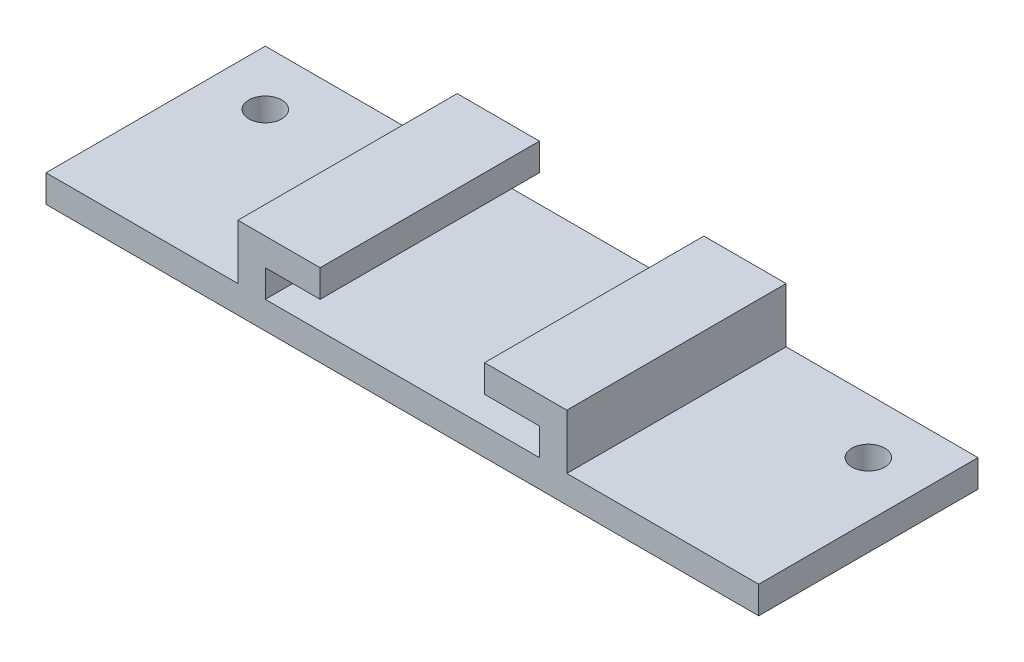
ISO-10303-21;
HEADER;
FILE_DESCRIPTION(('STEP AP214'),'2;1');
FILE_NAME('part.step','',(''),(''),'','','');
FILE_SCHEMA(('AUTOMOTIVE_DESIGN { 1 0 10303 214 1 1 1 1 }'));
ENDSEC;
DATA;
#1=APPLICATION_CONTEXT('core data for automotive mechanical design processes');
#2=APPLICATION_PROTOCOL_DEFINITION('international standard','automotive_design',2000,#1);
#3=PRODUCT_CONTEXT('',#1,'mechanical');
#4=PRODUCT('Part','Part','',(#3));
#5=PRODUCT_RELATED_PRODUCT_CATEGORY('part','',(#4));
#6=PRODUCT_DEFINITION_FORMATION('','',#4);
#7=PRODUCT_DEFINITION_CONTEXT('part definition',#1,'design');
#8=PRODUCT_DEFINITION('design','',#6,#7);
#9=PRODUCT_DEFINITION_SHAPE('','',#8);
#10=(LENGTH_UNIT() NAMED_UNIT(*) SI_UNIT(.MILLI.,.METRE.));
#11=(NAMED_UNIT(*) PLANE_ANGLE_UNIT() SI_UNIT($,.RADIAN.));
#12=(NAMED_UNIT(*) SI_UNIT($,.STERADIAN.) SOLID_ANGLE_UNIT());
#13=UNCERTAINTY_MEASURE_WITH_UNIT(LENGTH_MEASURE(1.E-05),#10,'distance_accuracy_value','');
#14=(GEOMETRIC_REPRESENTATION_CONTEXT(3) GLOBAL_UNCERTAINTY_ASSIGNED_CONTEXT((#13)) GLOBAL_UNIT_ASSIGNED_CONTEXT((#10,
#11,#12)) REPRESENTATION_CONTEXT('',''));
#15=CARTESIAN_POINT('',(0.,0.,0.));
#16=DIRECTION('',(0.,0.,1.));
#17=DIRECTION('',(1.,0.,0.));
#18=AXIS2_PLACEMENT_3D('',#15,#16,#17);
#19=CARTESIAN_POINT('',(0.,10.,0.));
#20=DIRECTION('',(0.,-1.,0.));
#21=DIRECTION('',(0.,0.,-1.));
#22=AXIS2_PLACEMENT_3D('',#19,#20,#21);
#23=PLANE('',#22);
#24=DIRECTION('',(0.,0.,1.));
#25=VECTOR('',#24,1.);
#26=CARTESIAN_POINT('',(50.,10.,-163.69316876853));
#27=LINE('',#26,#25);
#28=CARTESIAN_POINT('',(50.,10.,-40.));
#29=VERTEX_POINT('',#28);
#30=CARTESIAN_POINT('',(50.,10.,40.));
#31=VERTEX_POINT('',#30);
#32=EDGE_CURVE('E215',#29,#31,#27,.T.);
#33=ORIENTED_EDGE('',*,*,#32,.F.);
#34=DIRECTION('',(-1.,0.,0.));
#35=VECTOR('',#34,1.);
#36=CARTESIAN_POINT('',(-130.,10.,-40.));
#37=LINE('',#36,#35);
#38=CARTESIAN_POINT('',(-50.,10.,-40.));
#39=VERTEX_POINT('',#38);
#40=EDGE_CURVE('E235',#29,#39,#37,.T.);
#41=ORIENTED_EDGE('',*,*,#40,.T.);
#42=DIRECTION('',(0.,0.,1.));
#43=VECTOR('',#42,1.);
#44=CARTESIAN_POINT('',(-50.,10.,-163.69316876853));
#45=LINE('',#44,#43);
#46=CARTESIAN_POINT('',(-50.,10.,40.));
#47=VERTEX_POINT('',#46);
#48=EDGE_CURVE('E213',#39,#47,#45,.T.);
#49=ORIENTED_EDGE('',*,*,#48,.T.);
#50=DIRECTION('',(1.,0.,0.));
#51=VECTOR('',#50,1.);
#52=CARTESIAN_POINT('',(-130.,10.,40.));
#53=LINE('',#52,#51);
#54=EDGE_CURVE('E58',#47,#31,#53,.T.);
#55=ORIENTED_EDGE('',*,*,#54,.T.);
#56=EDGE_LOOP('',(#33,#41,#49,#55));
#57=FACE_BOUND('',#56,.T.);
#58=ADVANCED_FACE('F35',(#57),#23,.F.);
#59=CARTESIAN_POINT('',(-110.,10.,-20.));
#60=DIRECTION('',(0.,1.,0.));
#61=DIRECTION('',(0.,0.,1.));
#62=AXIS2_PLACEMENT_3D('',#59,#60,#61);
#63=CIRCLE('',#62,6.00000000000001);
#64=CARTESIAN_POINT('',(-110.,10.,-14.));
#65=VERTEX_POINT('',#64);
#66=EDGE_CURVE('E177',#65,#65,#63,.T.);
#67=ORIENTED_EDGE('',*,*,#66,.F.);
#68=EDGE_LOOP('',(#67));
#69=FACE_BOUND('',#68,.T.);
#70=CARTESIAN_POINT('',(-130.,10.,40.));
#71=VERTEX_POINT('',#70);
#72=CARTESIAN_POINT('',(-60.,10.,40.));
#73=VERTEX_POINT('',#72);
#74=EDGE_CURVE('E238',#71,#73,#53,.T.);
#75=ORIENTED_EDGE('',*,*,#74,.T.);
#76=DIRECTION('',(0.,0.,-1.));
#77=VECTOR('',#76,1.);
#78=CARTESIAN_POINT('',(-60.,10.,0.));
#79=LINE('',#78,#77);
#80=CARTESIAN_POINT('',(-60.,10.,-40.));
#81=VERTEX_POINT('',#80);
#82=EDGE_CURVE('E223',#73,#81,#79,.T.);
#83=ORIENTED_EDGE('',*,*,#82,.T.);
#84=CARTESIAN_POINT('',(-130.,10.,-40.));
#85=VERTEX_POINT('',#84);
#86=EDGE_CURVE('E230',#81,#85,#37,.T.);
#87=ORIENTED_EDGE('',*,*,#86,.T.);
#88=DIRECTION('',(0.,0.,1.));
#89=VECTOR('',#88,1.);
#90=CARTESIAN_POINT('',(-130.,10.,40.));
#91=LINE('',#90,#89);
#92=EDGE_CURVE('E234',#85,#71,#91,.T.);
#93=ORIENTED_EDGE('',*,*,#92,.T.);
#94=EDGE_LOOP('',(#75,#83,#87,#93));
#95=FACE_BOUND('',#94,.T.);
#96=ADVANCED_FACE('F307',(#69,#95),#23,.F.);
#97=CARTESIAN_POINT('',(130.,10.,40.));
#98=DIRECTION('',(-1.,0.,0.));
#99=DIRECTION('',(0.,0.,1.));
#100=AXIS2_PLACEMENT_3D('',#97,#98,#99);
#101=PLANE('',#100);
#102=DIRECTION('',(0.,0.,-1.));
#103=VECTOR('',#102,1.);
#104=CARTESIAN_POINT('',(130.,0.,40.));
#105=LINE('',#104,#103);
#106=CARTESIAN_POINT('',(130.,0.,40.));
#107=VERTEX_POINT('',#106);
#108=CARTESIAN_POINT('',(130.,0.,-40.));
#109=VERTEX_POINT('',#108);
#110=EDGE_CURVE('E226',#107,#109,#105,.T.);
#111=ORIENTED_EDGE('',*,*,#110,.T.);
#112=DIRECTION('',(0.,-1.,0.));
#113=VECTOR('',#112,1.);
#114=CARTESIAN_POINT('',(130.,10.,-40.));
#115=LINE('',#114,#113);
#116=CARTESIAN_POINT('',(130.,10.,-40.));
#117=VERTEX_POINT('',#116);
#118=EDGE_CURVE('E11',#117,#109,#115,.T.);
#119=ORIENTED_EDGE('',*,*,#118,.F.);
#120=DIRECTION('',(0.,0.,-1.));
#121=VECTOR('',#120,1.);
#122=CARTESIAN_POINT('',(130.,10.,40.));
#123=LINE('',#122,#121);
#124=CARTESIAN_POINT('',(130.,10.,40.));
#125=VERTEX_POINT('',#124);
#126=EDGE_CURVE('E227',#125,#117,#123,.T.);
#127=ORIENTED_EDGE('',*,*,#126,.F.);
#128=DIRECTION('',(0.,-1.,0.));
#129=VECTOR('',#128,1.);
#130=CARTESIAN_POINT('',(130.,10.,40.));
#131=LINE('',#130,#129);
#132=EDGE_CURVE('E240',#125,#107,#131,.T.);
#133=ORIENTED_EDGE('',*,*,#132,.T.);
#134=EDGE_LOOP('',(#111,#119,#127,#133));
#135=FACE_BOUND('',#134,.T.);
#136=ADVANCED_FACE('F37',(#135),#101,.F.);
#137=CARTESIAN_POINT('',(-130.,10.,-40.));
#138=DIRECTION('',(0.,0.,1.));
#139=DIRECTION('',(1.,0.,0.));
#140=AXIS2_PLACEMENT_3D('',#137,#138,#139);
#141=PLANE('',#140);
#142=DIRECTION('',(-1.,0.,0.));
#143=VECTOR('',#142,1.);
#144=CARTESIAN_POINT('',(-130.,0.,-40.));
#145=LINE('',#144,#143);
#146=CARTESIAN_POINT('',(-130.,0.,-40.));
#147=VERTEX_POINT('',#146);
#148=EDGE_CURVE('E243',#109,#147,#145,.T.);
#149=ORIENTED_EDGE('',*,*,#148,.T.);
#150=DIRECTION('',(0.,-1.,0.));
#151=VECTOR('',#150,1.);
#152=CARTESIAN_POINT('',(-130.,10.,-40.));
#153=LINE('',#152,#151);
#154=EDGE_CURVE('E43',#85,#147,#153,.T.);
#155=ORIENTED_EDGE('',*,*,#154,.F.);
#156=ORIENTED_EDGE('',*,*,#86,.F.);
#157=DIRECTION('',(0.,1.,0.));
#158=VECTOR('',#157,1.);
#159=CARTESIAN_POINT('',(-60.,25.,-40.));
#160=LINE('',#159,#158);
#161=CARTESIAN_POINT('',(-60.,30.,-40.));
#162=VERTEX_POINT('',#161);
#163=EDGE_CURVE('E275',#81,#162,#160,.T.);
#164=ORIENTED_EDGE('',*,*,#163,.T.);
#165=DIRECTION('',(1.,0.,0.));
#166=VECTOR('',#165,1.);
#167=CARTESIAN_POINT('',(-30.,30.,-40.));
#168=LINE('',#167,#166);
#169=CARTESIAN_POINT('',(-30.,30.,-40.));
#170=VERTEX_POINT('',#169);
#171=EDGE_CURVE('E276',#162,#170,#168,.T.);
#172=ORIENTED_EDGE('',*,*,#171,.T.);
#173=DIRECTION('',(0.,1.,0.));
#174=VECTOR('',#173,1.);
#175=CARTESIAN_POINT('',(-30.,30.,-40.));
#176=LINE('',#175,#174);
#177=CARTESIAN_POINT('',(-30.,20.,-40.));
#178=VERTEX_POINT('',#177);
#179=EDGE_CURVE('E280',#178,#170,#176,.T.);
#180=ORIENTED_EDGE('',*,*,#179,.F.);
#181=DIRECTION('',(1.,0.,0.));
#182=VECTOR('',#181,1.);
#183=CARTESIAN_POINT('',(-30.,20.,-40.));
#184=LINE('',#183,#182);
#185=CARTESIAN_POINT('',(-50.,20.,-40.));
#186=VERTEX_POINT('',#185);
#187=EDGE_CURVE('E283',#186,#178,#184,.T.);
#188=ORIENTED_EDGE('',*,*,#187,.F.);
#189=DIRECTION('',(0.,1.,0.));
#190=VECTOR('',#189,1.);
#191=CARTESIAN_POINT('',(-50.,25.,-40.));
#192=LINE('',#191,#190);
#193=EDGE_CURVE('E286',#39,#186,#192,.T.);
#194=ORIENTED_EDGE('',*,*,#193,.F.);
#195=ORIENTED_EDGE('',*,*,#40,.F.);
#196=DIRECTION('',(0.,-1.,0.));
#197=VECTOR('',#196,1.);
#198=CARTESIAN_POINT('',(50.,5.00000000000002,-40.));
#199=LINE('',#198,#197);
#200=CARTESIAN_POINT('',(50.,20.,-40.));
#201=VERTEX_POINT('',#200);
#202=EDGE_CURVE('E289',#201,#29,#199,.T.);
#203=ORIENTED_EDGE('',*,*,#202,.F.);
#204=DIRECTION('',(1.,0.,0.));
#205=VECTOR('',#204,1.);
#206=CARTESIAN_POINT('',(55.,20.,-40.));
#207=LINE('',#206,#205);
#208=CARTESIAN_POINT('',(30.,20.,-40.));
#209=VERTEX_POINT('',#208);
#210=EDGE_CURVE('E221',#209,#201,#207,.T.);
#211=ORIENTED_EDGE('',*,*,#210,.F.);
#212=DIRECTION('',(0.,-1.,0.));
#213=VECTOR('',#212,1.);
#214=CARTESIAN_POINT('',(30.,20.,-40.));
#215=LINE('',#214,#213);
#216=CARTESIAN_POINT('',(30.,30.,-40.));
#217=VERTEX_POINT('',#216);
#218=EDGE_CURVE('E204',#217,#209,#215,.T.);
#219=ORIENTED_EDGE('',*,*,#218,.F.);
#220=DIRECTION('',(1.,0.,0.));
#221=VECTOR('',#220,1.);
#222=CARTESIAN_POINT('',(55.,30.,-40.));
#223=LINE('',#222,#221);
#224=CARTESIAN_POINT('',(60.,30.,-40.));
#225=VERTEX_POINT('',#224);
#226=EDGE_CURVE('E156',#217,#225,#223,.T.);
#227=ORIENTED_EDGE('',*,*,#226,.T.);
#228=DIRECTION('',(0.,-1.,0.));
#229=VECTOR('',#228,1.);
#230=CARTESIAN_POINT('',(60.,5.00000000000002,-40.));
#231=LINE('',#230,#229);
#232=CARTESIAN_POINT('',(60.,10.,-40.));
#233=VERTEX_POINT('',#232);
#234=EDGE_CURVE('E274',#225,#233,#231,.T.);
#235=ORIENTED_EDGE('',*,*,#234,.T.);
#236=EDGE_CURVE('E232',#117,#233,#37,.T.);
#237=ORIENTED_EDGE('',*,*,#236,.F.);
#238=ORIENTED_EDGE('',*,*,#118,.T.);
#239=EDGE_LOOP('',(#149,#155,#156,#164,#172,#180,#188,#194,#195,#203,#211,#219,#227,#235,#237,#238));
#240=FACE_BOUND('',#239,.T.);
#241=ADVANCED_FACE('F323',(#240),#141,.F.);
#242=CARTESIAN_POINT('',(-130.,10.,40.));
#243=DIRECTION('',(1.,0.,0.));
#244=DIRECTION('',(0.,0.,-1.));
#245=AXIS2_PLACEMENT_3D('',#242,#243,#244);
#246=PLANE('',#245);
#247=DIRECTION('',(0.,0.,1.));
#248=VECTOR('',#247,1.);
#249=CARTESIAN_POINT('',(-130.,0.,40.));
#250=LINE('',#249,#248);
#251=CARTESIAN_POINT('',(-130.,0.,40.));
#252=VERTEX_POINT('',#251);
#253=EDGE_CURVE('E245',#147,#252,#250,.T.);
#254=ORIENTED_EDGE('',*,*,#253,.T.);
#255=DIRECTION('',(0.,-1.,0.));
#256=VECTOR('',#255,1.);
#257=CARTESIAN_POINT('',(-130.,10.,40.));
#258=LINE('',#257,#256);
#259=EDGE_CURVE('E250',#71,#252,#258,.T.);
#260=ORIENTED_EDGE('',*,*,#259,.F.);
#261=ORIENTED_EDGE('',*,*,#92,.F.);
#262=ORIENTED_EDGE('',*,*,#154,.T.);
#263=EDGE_LOOP('',(#254,#260,#261,#262));
#264=FACE_BOUND('',#263,.T.);
#265=ADVANCED_FACE('F257',(#264),#246,.F.);
#266=CARTESIAN_POINT('',(-130.,10.,40.));
#267=DIRECTION('',(0.,0.,-1.));
#268=DIRECTION('',(-1.,0.,0.));
#269=AXIS2_PLACEMENT_3D('',#266,#267,#268);
#270=PLANE('',#269);
#271=CARTESIAN_POINT('',(60.,10.,40.));
#272=VERTEX_POINT('',#271);
#273=EDGE_CURVE('E237',#272,#125,#53,.T.);
#274=ORIENTED_EDGE('',*,*,#273,.F.);
#275=DIRECTION('',(0.,1.,0.));
#276=VECTOR('',#275,1.);
#277=CARTESIAN_POINT('',(60.,5.00000000000002,40.));
#278=LINE('',#277,#276);
#279=CARTESIAN_POINT('',(60.,30.,40.));
#280=VERTEX_POINT('',#279);
#281=EDGE_CURVE('E160',#272,#280,#278,.T.);
#282=ORIENTED_EDGE('',*,*,#281,.T.);
#283=DIRECTION('',(-1.,0.,0.));
#284=VECTOR('',#283,1.);
#285=CARTESIAN_POINT('',(55.,30.,40.));
#286=LINE('',#285,#284);
#287=CARTESIAN_POINT('',(30.,30.,40.));
#288=VERTEX_POINT('',#287);
#289=EDGE_CURVE('E155',#280,#288,#286,.T.);
#290=ORIENTED_EDGE('',*,*,#289,.T.);
#291=DIRECTION('',(0.,1.,0.));
#292=VECTOR('',#291,1.);
#293=CARTESIAN_POINT('',(30.,20.,40.));
#294=LINE('',#293,#292);
#295=CARTESIAN_POINT('',(30.,20.,40.));
#296=VERTEX_POINT('',#295);
#297=EDGE_CURVE('E163',#296,#288,#294,.T.);
#298=ORIENTED_EDGE('',*,*,#297,.F.);
#299=DIRECTION('',(-1.,0.,0.));
#300=VECTOR('',#299,1.);
#301=CARTESIAN_POINT('',(55.,20.,40.));
#302=LINE('',#301,#300);
#303=CARTESIAN_POINT('',(50.,20.,40.));
#304=VERTEX_POINT('',#303);
#305=EDGE_CURVE('E169',#304,#296,#302,.T.);
#306=ORIENTED_EDGE('',*,*,#305,.F.);
#307=DIRECTION('',(0.,1.,0.));
#308=VECTOR('',#307,1.);
#309=CARTESIAN_POINT('',(50.,5.00000000000002,40.));
#310=LINE('',#309,#308);
#311=EDGE_CURVE('E183',#31,#304,#310,.T.);
#312=ORIENTED_EDGE('',*,*,#311,.F.);
#313=ORIENTED_EDGE('',*,*,#54,.F.);
#314=DIRECTION('',(0.,-1.,0.));
#315=VECTOR('',#314,1.);
#316=CARTESIAN_POINT('',(-50.,25.,40.));
#317=LINE('',#316,#315);
#318=CARTESIAN_POINT('',(-50.,20.,40.));
#319=VERTEX_POINT('',#318);
#320=EDGE_CURVE('E186',#319,#47,#317,.T.);
#321=ORIENTED_EDGE('',*,*,#320,.F.);
#322=DIRECTION('',(-1.,0.,0.));
#323=VECTOR('',#322,1.);
#324=CARTESIAN_POINT('',(-30.,20.,40.));
#325=LINE('',#324,#323);
#326=CARTESIAN_POINT('',(-30.,20.,40.));
#327=VERTEX_POINT('',#326);
#328=EDGE_CURVE('E189',#327,#319,#325,.T.);
#329=ORIENTED_EDGE('',*,*,#328,.F.);
#330=DIRECTION('',(0.,-1.,0.));
#331=VECTOR('',#330,1.);
#332=CARTESIAN_POINT('',(-30.,30.,40.));
#333=LINE('',#332,#331);
#334=CARTESIAN_POINT('',(-30.,30.,40.));
#335=VERTEX_POINT('',#334);
#336=EDGE_CURVE('E192',#335,#327,#333,.T.);
#337=ORIENTED_EDGE('',*,*,#336,.F.);
#338=DIRECTION('',(-1.,0.,0.));
#339=VECTOR('',#338,1.);
#340=CARTESIAN_POINT('',(-30.,30.,40.));
#341=LINE('',#340,#339);
#342=CARTESIAN_POINT('',(-60.,30.,40.));
#343=VERTEX_POINT('',#342);
#344=EDGE_CURVE('E195',#335,#343,#341,.T.);
#345=ORIENTED_EDGE('',*,*,#344,.T.);
#346=DIRECTION('',(0.,-1.,0.));
#347=VECTOR('',#346,1.);
#348=CARTESIAN_POINT('',(-60.,25.,40.));
#349=LINE('',#348,#347);
#350=EDGE_CURVE('E198',#343,#73,#349,.T.);
#351=ORIENTED_EDGE('',*,*,#350,.T.);
#352=ORIENTED_EDGE('',*,*,#74,.F.);
#353=ORIENTED_EDGE('',*,*,#259,.T.);
#354=DIRECTION('',(1.,0.,0.));
#355=VECTOR('',#354,1.);
#356=CARTESIAN_POINT('',(-130.,0.,40.));
#357=LINE('',#356,#355);
#358=EDGE_CURVE('E231',#252,#107,#357,.T.);
#359=ORIENTED_EDGE('',*,*,#358,.T.);
#360=ORIENTED_EDGE('',*,*,#132,.F.);
#361=EDGE_LOOP('',(#274,#282,#290,#298,#306,#312,#313,#321,#329,#337,#345,#351,#352,#353,#359,#360));
#362=FACE_BOUND('',#361,.T.);
#363=ADVANCED_FACE('F171',(#362),#270,.F.);
#364=CARTESIAN_POINT('',(110.,10.,-20.));
#365=DIRECTION('',(0.,1.,0.));
#366=DIRECTION('',(0.,0.,1.));
#367=AXIS2_PLACEMENT_3D('',#364,#365,#366);
#368=CIRCLE('',#367,6.00000000000001);
#369=CARTESIAN_POINT('',(110.,10.,-14.));
#370=VERTEX_POINT('',#369);
#371=EDGE_CURVE('E299',#370,#370,#368,.T.);
#372=ORIENTED_EDGE('',*,*,#371,.F.);
#373=EDGE_LOOP('',(#372));
#374=FACE_BOUND('',#373,.T.);
#375=ORIENTED_EDGE('',*,*,#236,.T.);
#376=DIRECTION('',(0.,0.,1.));
#377=VECTOR('',#376,1.);
#378=CARTESIAN_POINT('',(60.,10.,0.));
#379=LINE('',#378,#377);
#380=EDGE_CURVE('E50',#233,#272,#379,.T.);
#381=ORIENTED_EDGE('',*,*,#380,.T.);
#382=ORIENTED_EDGE('',*,*,#273,.T.);
#383=ORIENTED_EDGE('',*,*,#126,.T.);
#384=EDGE_LOOP('',(#375,#381,#382,#383));
#385=FACE_BOUND('',#384,.T.);
#386=ADVANCED_FACE('F269',(#374,#385),#23,.F.);
#387=CARTESIAN_POINT('',(0.,0.,0.));
#388=DIRECTION('',(0.,-1.,0.));
#389=DIRECTION('',(0.,0.,-1.));
#390=AXIS2_PLACEMENT_3D('',#387,#388,#389);
#391=PLANE('',#390);
#392=CARTESIAN_POINT('',(110.,0.,-20.));
#393=DIRECTION('',(0.,1.,0.));
#394=DIRECTION('',(0.,0.,1.));
#395=AXIS2_PLACEMENT_3D('',#392,#393,#394);
#396=CIRCLE('',#395,5.99999999999999);
#397=CARTESIAN_POINT('',(110.,0.,-14.));
#398=VERTEX_POINT('',#397);
#399=EDGE_CURVE('E296',#398,#398,#396,.T.);
#400=ORIENTED_EDGE('',*,*,#399,.T.);
#401=EDGE_LOOP('',(#400));
#402=FACE_BOUND('',#401,.T.);
#403=CARTESIAN_POINT('',(-110.,0.,-20.));
#404=DIRECTION('',(0.,1.,0.));
#405=DIRECTION('',(0.,0.,1.));
#406=AXIS2_PLACEMENT_3D('',#403,#404,#405);
#407=CIRCLE('',#406,5.99999999999999);
#408=CARTESIAN_POINT('',(-110.,0.,-14.));
#409=VERTEX_POINT('',#408);
#410=EDGE_CURVE('E174',#409,#409,#407,.T.);
#411=ORIENTED_EDGE('',*,*,#410,.T.);
#412=EDGE_LOOP('',(#411));
#413=FACE_BOUND('',#412,.T.);
#414=ORIENTED_EDGE('',*,*,#110,.F.);
#415=ORIENTED_EDGE('',*,*,#358,.F.);
#416=ORIENTED_EDGE('',*,*,#253,.F.);
#417=ORIENTED_EDGE('',*,*,#148,.F.);
#418=EDGE_LOOP('',(#414,#415,#416,#417));
#419=FACE_BOUND('',#418,.T.);
#420=ADVANCED_FACE('F263',(#402,#413,#419),#391,.T.);
#421=CARTESIAN_POINT('',(-30.,20.,-163.69316876853));
#422=DIRECTION('',(0.,1.,0.));
#423=DIRECTION('',(-1.,0.,0.));
#424=AXIS2_PLACEMENT_3D('',#421,#422,#423);
#425=PLANE('',#424);
#426=DIRECTION('',(0.,0.,1.));
#427=VECTOR('',#426,1.);
#428=CARTESIAN_POINT('',(-50.,20.,-163.69316876853));
#429=LINE('',#428,#427);
#430=EDGE_CURVE('E211',#186,#319,#429,.T.);
#431=ORIENTED_EDGE('',*,*,#430,.F.);
#432=ORIENTED_EDGE('',*,*,#187,.T.);
#433=DIRECTION('',(0.,0.,1.));
#434=VECTOR('',#433,1.);
#435=CARTESIAN_POINT('',(-30.,20.,-163.69316876853));
#436=LINE('',#435,#434);
#437=EDGE_CURVE('E209',#178,#327,#436,.T.);
#438=ORIENTED_EDGE('',*,*,#437,.T.);
#439=ORIENTED_EDGE('',*,*,#328,.T.);
#440=EDGE_LOOP('',(#431,#432,#438,#439));
#441=FACE_BOUND('',#440,.T.);
#442=ADVANCED_FACE('F312',(#441),#425,.F.);
#443=CARTESIAN_POINT('',(-30.,30.,-163.69316876853));
#444=DIRECTION('',(-1.,0.,0.));
#445=DIRECTION('',(0.,0.,1.));
#446=AXIS2_PLACEMENT_3D('',#443,#444,#445);
#447=PLANE('',#446);
#448=ORIENTED_EDGE('',*,*,#437,.F.);
#449=ORIENTED_EDGE('',*,*,#179,.T.);
#450=DIRECTION('',(0.,0.,1.));
#451=VECTOR('',#450,1.);
#452=CARTESIAN_POINT('',(-30.,30.,-163.69316876853));
#453=LINE('',#452,#451);
#454=EDGE_CURVE('E207',#170,#335,#453,.T.);
#455=ORIENTED_EDGE('',*,*,#454,.T.);
#456=ORIENTED_EDGE('',*,*,#336,.T.);
#457=EDGE_LOOP('',(#448,#449,#455,#456));
#458=FACE_BOUND('',#457,.T.);
#459=ADVANCED_FACE('F382',(#458),#447,.F.);
#460=CARTESIAN_POINT('',(-30.,30.,-163.69316876853));
#461=DIRECTION('',(0.,1.,0.));
#462=DIRECTION('',(-1.,0.,0.));
#463=AXIS2_PLACEMENT_3D('',#460,#461,#462);
#464=PLANE('',#463);
#465=ORIENTED_EDGE('',*,*,#171,.F.);
#466=DIRECTION('',(0.,0.,1.));
#467=VECTOR('',#466,1.);
#468=CARTESIAN_POINT('',(-60.,30.,-163.69316876853));
#469=LINE('',#468,#467);
#470=EDGE_CURVE('E205',#162,#343,#469,.T.);
#471=ORIENTED_EDGE('',*,*,#470,.T.);
#472=ORIENTED_EDGE('',*,*,#344,.F.);
#473=ORIENTED_EDGE('',*,*,#454,.F.);
#474=EDGE_LOOP('',(#465,#471,#472,#473));
#475=FACE_BOUND('',#474,.T.);
#476=ADVANCED_FACE('F338',(#475),#464,.T.);
#477=CARTESIAN_POINT('',(-60.,25.,-163.69316876853));
#478=DIRECTION('',(-1.,0.,0.));
#479=DIRECTION('',(0.,-1.,0.));
#480=AXIS2_PLACEMENT_3D('',#477,#478,#479);
#481=PLANE('',#480);
#482=ORIENTED_EDGE('',*,*,#82,.F.);
#483=ORIENTED_EDGE('',*,*,#350,.F.);
#484=ORIENTED_EDGE('',*,*,#470,.F.);
#485=ORIENTED_EDGE('',*,*,#163,.F.);
#486=EDGE_LOOP('',(#482,#483,#484,#485));
#487=FACE_BOUND('',#486,.T.);
#488=ADVANCED_FACE('F330',(#487),#481,.T.);
#489=CARTESIAN_POINT('',(-50.,25.,-163.69316876853));
#490=DIRECTION('',(-1.,0.,0.));
#491=DIRECTION('',(0.,-1.,0.));
#492=AXIS2_PLACEMENT_3D('',#489,#490,#491);
#493=PLANE('',#492);
#494=ORIENTED_EDGE('',*,*,#48,.F.);
#495=ORIENTED_EDGE('',*,*,#193,.T.);
#496=ORIENTED_EDGE('',*,*,#430,.T.);
#497=ORIENTED_EDGE('',*,*,#320,.T.);
#498=EDGE_LOOP('',(#494,#495,#496,#497));
#499=FACE_BOUND('',#498,.T.);
#500=ADVANCED_FACE('F344',(#499),#493,.F.);
#501=CARTESIAN_POINT('',(60.,5.00000000000002,-163.69316876853));
#502=DIRECTION('',(1.,0.,0.));
#503=DIRECTION('',(0.,1.,0.));
#504=AXIS2_PLACEMENT_3D('',#501,#502,#503);
#505=PLANE('',#504);
#506=ORIENTED_EDGE('',*,*,#380,.F.);
#507=ORIENTED_EDGE('',*,*,#234,.F.);
#508=DIRECTION('',(0.,0.,1.));
#509=VECTOR('',#508,1.);
#510=CARTESIAN_POINT('',(60.,30.,-163.69316876853));
#511=LINE('',#510,#509);
#512=EDGE_CURVE('E202',#225,#280,#511,.T.);
#513=ORIENTED_EDGE('',*,*,#512,.T.);
#514=ORIENTED_EDGE('',*,*,#281,.F.);
#515=EDGE_LOOP('',(#506,#507,#513,#514));
#516=FACE_BOUND('',#515,.T.);
#517=ADVANCED_FACE('F271',(#516),#505,.T.);
#518=CARTESIAN_POINT('',(30.,20.,-163.69316876853));
#519=DIRECTION('',(1.,0.,0.));
#520=DIRECTION('',(0.,0.,-1.));
#521=AXIS2_PLACEMENT_3D('',#518,#519,#520);
#522=PLANE('',#521);
#523=DIRECTION('',(0.,0.,1.));
#524=VECTOR('',#523,1.);
#525=CARTESIAN_POINT('',(30.,30.,-163.69316876853));
#526=LINE('',#525,#524);
#527=EDGE_CURVE('E150',#217,#288,#526,.T.);
#528=ORIENTED_EDGE('',*,*,#527,.F.);
#529=ORIENTED_EDGE('',*,*,#218,.T.);
#530=DIRECTION('',(0.,0.,1.));
#531=VECTOR('',#530,1.);
#532=CARTESIAN_POINT('',(30.,20.,-163.69316876853));
#533=LINE('',#532,#531);
#534=EDGE_CURVE('E159',#209,#296,#533,.T.);
#535=ORIENTED_EDGE('',*,*,#534,.T.);
#536=ORIENTED_EDGE('',*,*,#297,.T.);
#537=EDGE_LOOP('',(#528,#529,#535,#536));
#538=FACE_BOUND('',#537,.T.);
#539=ADVANCED_FACE('F164',(#538),#522,.F.);
#540=CARTESIAN_POINT('',(55.,20.,-163.69316876853));
#541=DIRECTION('',(0.,1.,0.));
#542=DIRECTION('',(-1.,0.,0.));
#543=AXIS2_PLACEMENT_3D('',#540,#541,#542);
#544=PLANE('',#543);
#545=ORIENTED_EDGE('',*,*,#534,.F.);
#546=ORIENTED_EDGE('',*,*,#210,.T.);
#547=DIRECTION('',(0.,0.,1.));
#548=VECTOR('',#547,1.);
#549=CARTESIAN_POINT('',(50.,20.,-163.69316876853));
#550=LINE('',#549,#548);
#551=EDGE_CURVE('E217',#201,#304,#550,.T.);
#552=ORIENTED_EDGE('',*,*,#551,.T.);
#553=ORIENTED_EDGE('',*,*,#305,.T.);
#554=EDGE_LOOP('',(#545,#546,#552,#553));
#555=FACE_BOUND('',#554,.T.);
#556=ADVANCED_FACE('F351',(#555),#544,.F.);
#557=CARTESIAN_POINT('',(50.,5.00000000000002,-163.69316876853));
#558=DIRECTION('',(1.,0.,0.));
#559=DIRECTION('',(0.,1.,0.));
#560=AXIS2_PLACEMENT_3D('',#557,#558,#559);
#561=PLANE('',#560);
#562=ORIENTED_EDGE('',*,*,#551,.F.);
#563=ORIENTED_EDGE('',*,*,#202,.T.);
#564=ORIENTED_EDGE('',*,*,#32,.T.);
#565=ORIENTED_EDGE('',*,*,#311,.T.);
#566=EDGE_LOOP('',(#562,#563,#564,#565));
#567=FACE_BOUND('',#566,.T.);
#568=ADVANCED_FACE('F349',(#567),#561,.F.);
#569=CARTESIAN_POINT('',(55.,30.,-163.69316876853));
#570=DIRECTION('',(0.,1.,0.));
#571=DIRECTION('',(-1.,0.,0.));
#572=AXIS2_PLACEMENT_3D('',#569,#570,#571);
#573=PLANE('',#572);
#574=ORIENTED_EDGE('',*,*,#226,.F.);
#575=ORIENTED_EDGE('',*,*,#527,.T.);
#576=ORIENTED_EDGE('',*,*,#289,.F.);
#577=ORIENTED_EDGE('',*,*,#512,.F.);
#578=EDGE_LOOP('',(#574,#575,#576,#577));
#579=FACE_BOUND('',#578,.T.);
#580=ADVANCED_FACE('F152',(#579),#573,.T.);
#581=CARTESIAN_POINT('',(-110.,10.,-20.));
#582=DIRECTION('',(0.,1.,0.));
#583=DIRECTION('',(0.,0.,1.));
#584=AXIS2_PLACEMENT_3D('',#581,#582,#583);
#585=CYLINDRICAL_SURFACE('',#584,6.);
#586=ORIENTED_EDGE('',*,*,#410,.F.);
#587=EDGE_LOOP('',(#586));
#588=FACE_BOUND('',#587,.T.);
#589=ORIENTED_EDGE('',*,*,#66,.T.);
#590=EDGE_LOOP('',(#589));
#591=FACE_BOUND('',#590,.T.);
#592=ADVANCED_FACE('F362',(#588,#591),#585,.F.);
#593=CARTESIAN_POINT('',(110.,10.,-20.));
#594=DIRECTION('',(0.,1.,0.));
#595=DIRECTION('',(0.,0.,1.));
#596=AXIS2_PLACEMENT_3D('',#593,#594,#595);
#597=CYLINDRICAL_SURFACE('',#596,6.);
#598=ORIENTED_EDGE('',*,*,#399,.F.);
#599=EDGE_LOOP('',(#598));
#600=FACE_BOUND('',#599,.T.);
#601=ORIENTED_EDGE('',*,*,#371,.T.);
#602=EDGE_LOOP('',(#601));
#603=FACE_BOUND('',#602,.T.);
#604=ADVANCED_FACE('F303',(#600,#603),#597,.F.);
#605=CLOSED_SHELL('',(#58,#96,#136,#241,#265,#363,#386,#420,#442,#459,#476,#488,#500,#517,#539,
#556,#568,#580,#592,#604));
#606=MANIFOLD_SOLID_BREP('B2',#605);
#607=ADVANCED_BREP_SHAPE_REPRESENTATION('',(#18,#606),#14);
#608=SHAPE_DEFINITION_REPRESENTATION(#9,#607);
ENDSEC;
END-ISO-10303-21;
